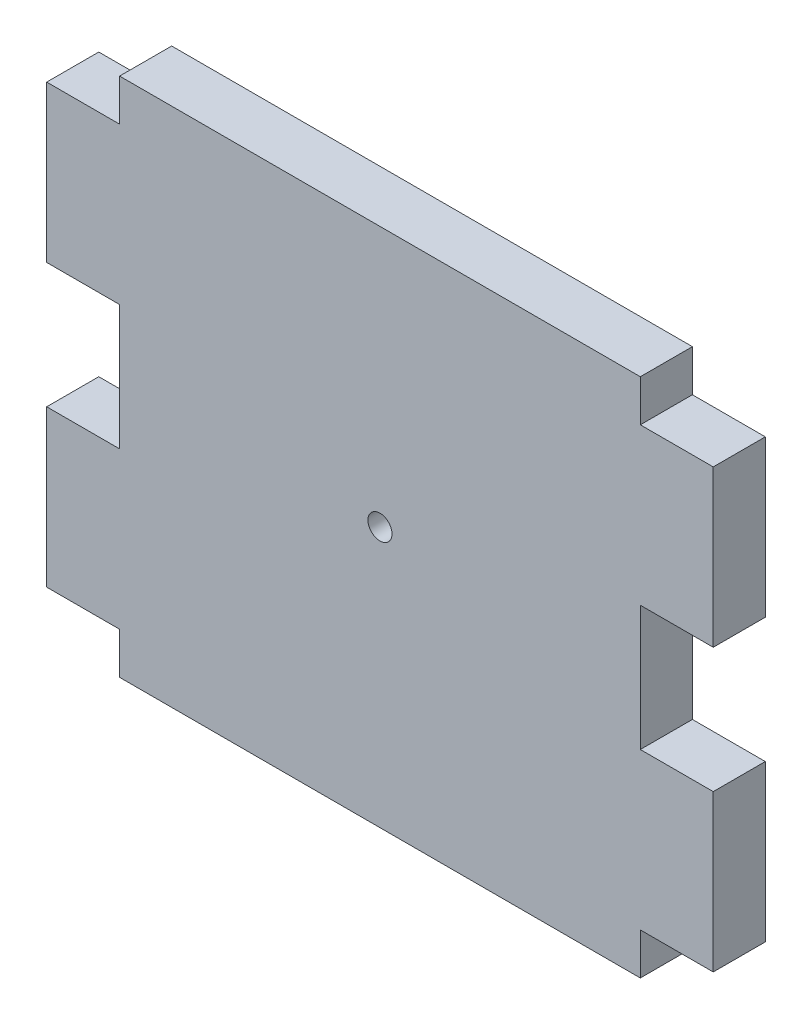
ISO-10303-21;
HEADER;
FILE_DESCRIPTION(('STEP AP214'),'2;1');
FILE_NAME('part.step','',(''),(''),'','','');
FILE_SCHEMA(('AUTOMOTIVE_DESIGN { 1 0 10303 214 1 1 1 1 }'));
ENDSEC;
DATA;
#1=APPLICATION_CONTEXT('core data for automotive mechanical design processes');
#2=APPLICATION_PROTOCOL_DEFINITION('international standard','automotive_design',2000,#1);
#3=PRODUCT_CONTEXT('',#1,'mechanical');
#4=PRODUCT('Part','Part','',(#3));
#5=PRODUCT_RELATED_PRODUCT_CATEGORY('part','',(#4));
#6=PRODUCT_DEFINITION_FORMATION('','',#4);
#7=PRODUCT_DEFINITION_CONTEXT('part definition',#1,'design');
#8=PRODUCT_DEFINITION('design','',#6,#7);
#9=PRODUCT_DEFINITION_SHAPE('','',#8);
#10=(LENGTH_UNIT() NAMED_UNIT(*) SI_UNIT(.MILLI.,.METRE.));
#11=(NAMED_UNIT(*) PLANE_ANGLE_UNIT() SI_UNIT($,.RADIAN.));
#12=(NAMED_UNIT(*) SI_UNIT($,.STERADIAN.) SOLID_ANGLE_UNIT());
#13=UNCERTAINTY_MEASURE_WITH_UNIT(LENGTH_MEASURE(1.E-05),#10,'distance_accuracy_value','');
#14=(GEOMETRIC_REPRESENTATION_CONTEXT(3) GLOBAL_UNCERTAINTY_ASSIGNED_CONTEXT((#13)) GLOBAL_UNIT_ASSIGNED_CONTEXT((#10,
#11,#12)) REPRESENTATION_CONTEXT('',''));
#15=CARTESIAN_POINT('',(0.,0.,0.));
#16=DIRECTION('',(0.,0.,1.));
#17=DIRECTION('',(1.,0.,0.));
#18=AXIS2_PLACEMENT_3D('',#15,#16,#17);
#19=CARTESIAN_POINT('',(0.,-4.00000000000001,5.));
#20=DIRECTION('',(1.,0.,0.));
#21=DIRECTION('',(0.,0.,-1.));
#22=AXIS2_PLACEMENT_3D('',#19,#20,#21);
#23=PLANE('',#22);
#24=DIRECTION('',(0.,-1.,0.));
#25=VECTOR('',#24,1.);
#26=CARTESIAN_POINT('',(0.,-4.00000000000001,0.));
#27=LINE('',#26,#25);
#28=CARTESIAN_POINT('',(0.,0.,0.));
#29=VERTEX_POINT('',#28);
#30=CARTESIAN_POINT('',(0.,-4.00000000000001,0.));
#31=VERTEX_POINT('',#30);
#32=EDGE_CURVE('E212',#29,#31,#27,.T.);
#33=ORIENTED_EDGE('',*,*,#32,.T.);
#34=DIRECTION('',(0.,0.,-1.));
#35=VECTOR('',#34,1.);
#36=CARTESIAN_POINT('',(0.,-4.00000000000001,5.));
#37=LINE('',#36,#35);
#38=CARTESIAN_POINT('',(0.,-4.00000000000001,5.));
#39=VERTEX_POINT('',#38);
#40=EDGE_CURVE('E11',#39,#31,#37,.T.);
#41=ORIENTED_EDGE('',*,*,#40,.F.);
#42=DIRECTION('',(0.,-1.,0.));
#43=VECTOR('',#42,1.);
#44=CARTESIAN_POINT('',(0.,-4.00000000000001,5.));
#45=LINE('',#44,#43);
#46=CARTESIAN_POINT('',(0.,0.,5.));
#47=VERTEX_POINT('',#46);
#48=EDGE_CURVE('E270',#47,#39,#45,.T.);
#49=ORIENTED_EDGE('',*,*,#48,.F.);
#50=DIRECTION('',(0.,0.,-1.));
#51=VECTOR('',#50,1.);
#52=CARTESIAN_POINT('',(0.,0.,5.));
#53=LINE('',#52,#51);
#54=EDGE_CURVE('E208',#47,#29,#53,.T.);
#55=ORIENTED_EDGE('',*,*,#54,.T.);
#56=EDGE_LOOP('',(#33,#41,#49,#55));
#57=FACE_BOUND('',#56,.T.);
#58=ADVANCED_FACE('F38',(#57),#23,.F.);
#59=CARTESIAN_POINT('',(0.,-4.00000000000001,5.));
#60=DIRECTION('',(0.,-1.,0.));
#61=DIRECTION('',(1.,0.,0.));
#62=AXIS2_PLACEMENT_3D('',#59,#60,#61);
#63=PLANE('',#62);
#64=DIRECTION('',(-1.,0.,0.));
#65=VECTOR('',#64,1.);
#66=CARTESIAN_POINT('',(0.,-4.00000000000001,0.));
#67=LINE('',#66,#65);
#68=CARTESIAN_POINT('',(-7.,-4.00000000000001,0.));
#69=VERTEX_POINT('',#68);
#70=EDGE_CURVE('E216',#31,#69,#67,.T.);
#71=ORIENTED_EDGE('',*,*,#70,.T.);
#72=DIRECTION('',(0.,0.,-1.));
#73=VECTOR('',#72,1.);
#74=CARTESIAN_POINT('',(-7.,-4.00000000000001,5.));
#75=LINE('',#74,#73);
#76=CARTESIAN_POINT('',(-7.,-4.00000000000001,5.));
#77=VERTEX_POINT('',#76);
#78=EDGE_CURVE('E48',#77,#69,#75,.T.);
#79=ORIENTED_EDGE('',*,*,#78,.F.);
#80=DIRECTION('',(-1.,0.,0.));
#81=VECTOR('',#80,1.);
#82=CARTESIAN_POINT('',(0.,-4.00000000000001,5.));
#83=LINE('',#82,#81);
#84=EDGE_CURVE('E135',#39,#77,#83,.T.);
#85=ORIENTED_EDGE('',*,*,#84,.F.);
#86=ORIENTED_EDGE('',*,*,#40,.T.);
#87=EDGE_LOOP('',(#71,#79,#85,#86));
#88=FACE_BOUND('',#87,.T.);
#89=ADVANCED_FACE('F423',(#88),#63,.F.);
#90=CARTESIAN_POINT('',(-7.,-4.00000000000001,5.));
#91=DIRECTION('',(1.,0.,0.));
#92=DIRECTION('',(0.,1.,0.));
#93=AXIS2_PLACEMENT_3D('',#90,#91,#92);
#94=PLANE('',#93);
#95=DIRECTION('',(0.,-1.,0.));
#96=VECTOR('',#95,1.);
#97=CARTESIAN_POINT('',(-7.,-4.00000000000001,0.));
#98=LINE('',#97,#96);
#99=CARTESIAN_POINT('',(-7.,-19.,0.));
#100=VERTEX_POINT('',#99);
#101=EDGE_CURVE('E219',#69,#100,#98,.T.);
#102=ORIENTED_EDGE('',*,*,#101,.T.);
#103=DIRECTION('',(0.,0.,-1.));
#104=VECTOR('',#103,1.);
#105=CARTESIAN_POINT('',(-7.,-19.,5.));
#106=LINE('',#105,#104);
#107=CARTESIAN_POINT('',(-7.,-19.,5.));
#108=VERTEX_POINT('',#107);
#109=EDGE_CURVE('E329',#108,#100,#106,.T.);
#110=ORIENTED_EDGE('',*,*,#109,.F.);
#111=DIRECTION('',(0.,-1.,0.));
#112=VECTOR('',#111,1.);
#113=CARTESIAN_POINT('',(-7.,-4.00000000000001,5.));
#114=LINE('',#113,#112);
#115=EDGE_CURVE('E340',#77,#108,#114,.T.);
#116=ORIENTED_EDGE('',*,*,#115,.F.);
#117=ORIENTED_EDGE('',*,*,#78,.T.);
#118=EDGE_LOOP('',(#102,#110,#116,#117));
#119=FACE_BOUND('',#118,.T.);
#120=ADVANCED_FACE('F338',(#119),#94,.F.);
#121=CARTESIAN_POINT('',(-7.,-19.,5.));
#122=DIRECTION('',(0.,1.,0.));
#123=DIRECTION('',(0.,0.,1.));
#124=AXIS2_PLACEMENT_3D('',#121,#122,#123);
#125=PLANE('',#124);
#126=DIRECTION('',(1.,0.,0.));
#127=VECTOR('',#126,1.);
#128=CARTESIAN_POINT('',(-7.,-19.,0.));
#129=LINE('',#128,#127);
#130=CARTESIAN_POINT('',(0.,-19.,0.));
#131=VERTEX_POINT('',#130);
#132=EDGE_CURVE('E222',#100,#131,#129,.T.);
#133=ORIENTED_EDGE('',*,*,#132,.T.);
#134=DIRECTION('',(0.,0.,-1.));
#135=VECTOR('',#134,1.);
#136=CARTESIAN_POINT('',(0.,-19.,5.));
#137=LINE('',#136,#135);
#138=CARTESIAN_POINT('',(0.,-19.,5.));
#139=VERTEX_POINT('',#138);
#140=EDGE_CURVE('E325',#139,#131,#137,.T.);
#141=ORIENTED_EDGE('',*,*,#140,.F.);
#142=DIRECTION('',(1.,0.,0.));
#143=VECTOR('',#142,1.);
#144=CARTESIAN_POINT('',(-7.,-19.,5.));
#145=LINE('',#144,#143);
#146=EDGE_CURVE('E359',#108,#139,#145,.T.);
#147=ORIENTED_EDGE('',*,*,#146,.F.);
#148=ORIENTED_EDGE('',*,*,#109,.T.);
#149=EDGE_LOOP('',(#133,#141,#147,#148));
#150=FACE_BOUND('',#149,.T.);
#151=ADVANCED_FACE('F349',(#150),#125,.F.);
#152=CARTESIAN_POINT('',(0.,-31.,5.));
#153=DIRECTION('',(1.,0.,0.));
#154=DIRECTION('',(0.,0.,-1.));
#155=AXIS2_PLACEMENT_3D('',#152,#153,#154);
#156=PLANE('',#155);
#157=DIRECTION('',(0.,-1.,0.));
#158=VECTOR('',#157,1.);
#159=CARTESIAN_POINT('',(0.,-31.,0.));
#160=LINE('',#159,#158);
#161=CARTESIAN_POINT('',(0.,-31.,0.));
#162=VERTEX_POINT('',#161);
#163=EDGE_CURVE('E225',#131,#162,#160,.T.);
#164=ORIENTED_EDGE('',*,*,#163,.T.);
#165=DIRECTION('',(0.,0.,-1.));
#166=VECTOR('',#165,1.);
#167=CARTESIAN_POINT('',(0.,-31.,5.));
#168=LINE('',#167,#166);
#169=CARTESIAN_POINT('',(0.,-31.,5.));
#170=VERTEX_POINT('',#169);
#171=EDGE_CURVE('E321',#170,#162,#168,.T.);
#172=ORIENTED_EDGE('',*,*,#171,.F.);
#173=DIRECTION('',(0.,-1.,0.));
#174=VECTOR('',#173,1.);
#175=CARTESIAN_POINT('',(0.,-31.,5.));
#176=LINE('',#175,#174);
#177=EDGE_CURVE('E355',#139,#170,#176,.T.);
#178=ORIENTED_EDGE('',*,*,#177,.F.);
#179=ORIENTED_EDGE('',*,*,#140,.T.);
#180=EDGE_LOOP('',(#164,#172,#178,#179));
#181=FACE_BOUND('',#180,.T.);
#182=ADVANCED_FACE('F353',(#181),#156,.F.);
#183=CARTESIAN_POINT('',(-7.,-31.,5.));
#184=DIRECTION('',(0.,-1.,0.));
#185=DIRECTION('',(0.,0.,-1.));
#186=AXIS2_PLACEMENT_3D('',#183,#184,#185);
#187=PLANE('',#186);
#188=DIRECTION('',(-1.,0.,0.));
#189=VECTOR('',#188,1.);
#190=CARTESIAN_POINT('',(-7.,-31.,0.));
#191=LINE('',#190,#189);
#192=CARTESIAN_POINT('',(-7.,-31.,0.));
#193=VERTEX_POINT('',#192);
#194=EDGE_CURVE('E228',#162,#193,#191,.T.);
#195=ORIENTED_EDGE('',*,*,#194,.T.);
#196=DIRECTION('',(0.,0.,-1.));
#197=VECTOR('',#196,1.);
#198=CARTESIAN_POINT('',(-7.,-31.,5.));
#199=LINE('',#198,#197);
#200=CARTESIAN_POINT('',(-7.,-31.,5.));
#201=VERTEX_POINT('',#200);
#202=EDGE_CURVE('E317',#201,#193,#199,.T.);
#203=ORIENTED_EDGE('',*,*,#202,.F.);
#204=DIRECTION('',(-1.,0.,0.));
#205=VECTOR('',#204,1.);
#206=CARTESIAN_POINT('',(-7.,-31.,5.));
#207=LINE('',#206,#205);
#208=EDGE_CURVE('E358',#170,#201,#207,.T.);
#209=ORIENTED_EDGE('',*,*,#208,.F.);
#210=ORIENTED_EDGE('',*,*,#171,.T.);
#211=EDGE_LOOP('',(#195,#203,#209,#210));
#212=FACE_BOUND('',#211,.T.);
#213=ADVANCED_FACE('F436',(#212),#187,.F.);
#214=CARTESIAN_POINT('',(-7.,-46.,5.));
#215=DIRECTION('',(1.,0.,0.));
#216=DIRECTION('',(0.,1.,0.));
#217=AXIS2_PLACEMENT_3D('',#214,#215,#216);
#218=PLANE('',#217);
#219=DIRECTION('',(0.,-1.,0.));
#220=VECTOR('',#219,1.);
#221=CARTESIAN_POINT('',(-7.,-46.,0.));
#222=LINE('',#221,#220);
#223=CARTESIAN_POINT('',(-7.,-46.,0.));
#224=VERTEX_POINT('',#223);
#225=EDGE_CURVE('E231',#193,#224,#222,.T.);
#226=ORIENTED_EDGE('',*,*,#225,.T.);
#227=DIRECTION('',(0.,0.,-1.));
#228=VECTOR('',#227,1.);
#229=CARTESIAN_POINT('',(-7.,-46.,5.));
#230=LINE('',#229,#228);
#231=CARTESIAN_POINT('',(-7.,-46.,5.));
#232=VERTEX_POINT('',#231);
#233=EDGE_CURVE('E313',#232,#224,#230,.T.);
#234=ORIENTED_EDGE('',*,*,#233,.F.);
#235=DIRECTION('',(0.,-1.,0.));
#236=VECTOR('',#235,1.);
#237=CARTESIAN_POINT('',(-7.,-46.,5.));
#238=LINE('',#237,#236);
#239=EDGE_CURVE('E363',#201,#232,#238,.T.);
#240=ORIENTED_EDGE('',*,*,#239,.F.);
#241=ORIENTED_EDGE('',*,*,#202,.T.);
#242=EDGE_LOOP('',(#226,#234,#240,#241));
#243=FACE_BOUND('',#242,.T.);
#244=ADVANCED_FACE('F439',(#243),#218,.F.);
#245=CARTESIAN_POINT('',(0.,-46.,5.));
#246=DIRECTION('',(0.,1.,0.));
#247=DIRECTION('',(0.,0.,1.));
#248=AXIS2_PLACEMENT_3D('',#245,#246,#247);
#249=PLANE('',#248);
#250=DIRECTION('',(1.,0.,0.));
#251=VECTOR('',#250,1.);
#252=CARTESIAN_POINT('',(0.,-46.,0.));
#253=LINE('',#252,#251);
#254=CARTESIAN_POINT('',(0.,-46.,0.));
#255=VERTEX_POINT('',#254);
#256=EDGE_CURVE('E234',#224,#255,#253,.T.);
#257=ORIENTED_EDGE('',*,*,#256,.T.);
#258=DIRECTION('',(0.,0.,-1.));
#259=VECTOR('',#258,1.);
#260=CARTESIAN_POINT('',(0.,-46.,5.));
#261=LINE('',#260,#259);
#262=CARTESIAN_POINT('',(0.,-46.,5.));
#263=VERTEX_POINT('',#262);
#264=EDGE_CURVE('E309',#263,#255,#261,.T.);
#265=ORIENTED_EDGE('',*,*,#264,.F.);
#266=DIRECTION('',(1.,0.,0.));
#267=VECTOR('',#266,1.);
#268=CARTESIAN_POINT('',(0.,-46.,5.));
#269=LINE('',#268,#267);
#270=EDGE_CURVE('E370',#232,#263,#269,.T.);
#271=ORIENTED_EDGE('',*,*,#270,.F.);
#272=ORIENTED_EDGE('',*,*,#233,.T.);
#273=EDGE_LOOP('',(#257,#265,#271,#272));
#274=FACE_BOUND('',#273,.T.);
#275=ADVANCED_FACE('F443',(#274),#249,.F.);
#276=CARTESIAN_POINT('',(0.,-50.,5.));
#277=DIRECTION('',(1.,0.,0.));
#278=DIRECTION('',(0.,1.,0.));
#279=AXIS2_PLACEMENT_3D('',#276,#277,#278);
#280=PLANE('',#279);
#281=DIRECTION('',(0.,-1.,0.));
#282=VECTOR('',#281,1.);
#283=CARTESIAN_POINT('',(0.,-50.,0.));
#284=LINE('',#283,#282);
#285=CARTESIAN_POINT('',(0.,-50.,0.));
#286=VERTEX_POINT('',#285);
#287=EDGE_CURVE('E237',#255,#286,#284,.T.);
#288=ORIENTED_EDGE('',*,*,#287,.T.);
#289=DIRECTION('',(0.,0.,-1.));
#290=VECTOR('',#289,1.);
#291=CARTESIAN_POINT('',(0.,-50.,5.));
#292=LINE('',#291,#290);
#293=CARTESIAN_POINT('',(0.,-50.,5.));
#294=VERTEX_POINT('',#293);
#295=EDGE_CURVE('E305',#294,#286,#292,.T.);
#296=ORIENTED_EDGE('',*,*,#295,.F.);
#297=DIRECTION('',(0.,-1.,0.));
#298=VECTOR('',#297,1.);
#299=CARTESIAN_POINT('',(0.,-50.,5.));
#300=LINE('',#299,#298);
#301=EDGE_CURVE('E373',#263,#294,#300,.T.);
#302=ORIENTED_EDGE('',*,*,#301,.F.);
#303=ORIENTED_EDGE('',*,*,#264,.T.);
#304=EDGE_LOOP('',(#288,#296,#302,#303));
#305=FACE_BOUND('',#304,.T.);
#306=ADVANCED_FACE('F447',(#305),#280,.F.);
#307=CARTESIAN_POINT('',(50.,-50.,5.));
#308=DIRECTION('',(0.,1.,0.));
#309=DIRECTION('',(-1.,0.,0.));
#310=AXIS2_PLACEMENT_3D('',#307,#308,#309);
#311=PLANE('',#310);
#312=DIRECTION('',(1.,0.,0.));
#313=VECTOR('',#312,1.);
#314=CARTESIAN_POINT('',(50.,-50.,0.));
#315=LINE('',#314,#313);
#316=CARTESIAN_POINT('',(50.,-50.,0.));
#317=VERTEX_POINT('',#316);
#318=EDGE_CURVE('E240',#286,#317,#315,.T.);
#319=ORIENTED_EDGE('',*,*,#318,.T.);
#320=DIRECTION('',(0.,0.,-1.));
#321=VECTOR('',#320,1.);
#322=CARTESIAN_POINT('',(50.,-50.,5.));
#323=LINE('',#322,#321);
#324=CARTESIAN_POINT('',(50.,-50.,5.));
#325=VERTEX_POINT('',#324);
#326=EDGE_CURVE('E301',#325,#317,#323,.T.);
#327=ORIENTED_EDGE('',*,*,#326,.F.);
#328=DIRECTION('',(1.,0.,0.));
#329=VECTOR('',#328,1.);
#330=CARTESIAN_POINT('',(50.,-50.,5.));
#331=LINE('',#330,#329);
#332=EDGE_CURVE('E376',#294,#325,#331,.T.);
#333=ORIENTED_EDGE('',*,*,#332,.F.);
#334=ORIENTED_EDGE('',*,*,#295,.T.);
#335=EDGE_LOOP('',(#319,#327,#333,#334));
#336=FACE_BOUND('',#335,.T.);
#337=ADVANCED_FACE('F451',(#336),#311,.F.);
#338=CARTESIAN_POINT('',(50.,-46.,5.));
#339=DIRECTION('',(-1.,0.,0.));
#340=DIRECTION('',(0.,-1.,0.));
#341=AXIS2_PLACEMENT_3D('',#338,#339,#340);
#342=PLANE('',#341);
#343=DIRECTION('',(0.,1.,0.));
#344=VECTOR('',#343,1.);
#345=CARTESIAN_POINT('',(50.,-46.,0.));
#346=LINE('',#345,#344);
#347=CARTESIAN_POINT('',(50.,-46.,0.));
#348=VERTEX_POINT('',#347);
#349=EDGE_CURVE('E243',#317,#348,#346,.T.);
#350=ORIENTED_EDGE('',*,*,#349,.T.);
#351=DIRECTION('',(0.,0.,-1.));
#352=VECTOR('',#351,1.);
#353=CARTESIAN_POINT('',(50.,-46.,5.));
#354=LINE('',#353,#352);
#355=CARTESIAN_POINT('',(50.,-46.,5.));
#356=VERTEX_POINT('',#355);
#357=EDGE_CURVE('E297',#356,#348,#354,.T.);
#358=ORIENTED_EDGE('',*,*,#357,.F.);
#359=DIRECTION('',(0.,1.,0.));
#360=VECTOR('',#359,1.);
#361=CARTESIAN_POINT('',(50.,-46.,5.));
#362=LINE('',#361,#360);
#363=EDGE_CURVE('E379',#325,#356,#362,.T.);
#364=ORIENTED_EDGE('',*,*,#363,.F.);
#365=ORIENTED_EDGE('',*,*,#326,.T.);
#366=EDGE_LOOP('',(#350,#358,#364,#365));
#367=FACE_BOUND('',#366,.T.);
#368=ADVANCED_FACE('F455',(#367),#342,.F.);
#369=CARTESIAN_POINT('',(50.,-46.,5.));
#370=DIRECTION('',(0.,1.,0.));
#371=DIRECTION('',(0.,0.,1.));
#372=AXIS2_PLACEMENT_3D('',#369,#370,#371);
#373=PLANE('',#372);
#374=DIRECTION('',(1.,0.,0.));
#375=VECTOR('',#374,1.);
#376=CARTESIAN_POINT('',(50.,-46.,0.));
#377=LINE('',#376,#375);
#378=CARTESIAN_POINT('',(57.,-46.,0.));
#379=VERTEX_POINT('',#378);
#380=EDGE_CURVE('E246',#348,#379,#377,.T.);
#381=ORIENTED_EDGE('',*,*,#380,.T.);
#382=DIRECTION('',(0.,0.,-1.));
#383=VECTOR('',#382,1.);
#384=CARTESIAN_POINT('',(57.,-46.,5.));
#385=LINE('',#384,#383);
#386=CARTESIAN_POINT('',(57.,-46.,5.));
#387=VERTEX_POINT('',#386);
#388=EDGE_CURVE('E293',#387,#379,#385,.T.);
#389=ORIENTED_EDGE('',*,*,#388,.F.);
#390=DIRECTION('',(1.,0.,0.));
#391=VECTOR('',#390,1.);
#392=CARTESIAN_POINT('',(50.,-46.,5.));
#393=LINE('',#392,#391);
#394=EDGE_CURVE('E382',#356,#387,#393,.T.);
#395=ORIENTED_EDGE('',*,*,#394,.F.);
#396=ORIENTED_EDGE('',*,*,#357,.T.);
#397=EDGE_LOOP('',(#381,#389,#395,#396));
#398=FACE_BOUND('',#397,.T.);
#399=ADVANCED_FACE('F459',(#398),#373,.F.);
#400=CARTESIAN_POINT('',(57.,-46.,5.));
#401=DIRECTION('',(-1.,0.,0.));
#402=DIRECTION('',(0.,0.,1.));
#403=AXIS2_PLACEMENT_3D('',#400,#401,#402);
#404=PLANE('',#403);
#405=DIRECTION('',(0.,1.,0.));
#406=VECTOR('',#405,1.);
#407=CARTESIAN_POINT('',(57.,-46.,0.));
#408=LINE('',#407,#406);
#409=CARTESIAN_POINT('',(57.,-31.,0.));
#410=VERTEX_POINT('',#409);
#411=EDGE_CURVE('E249',#379,#410,#408,.T.);
#412=ORIENTED_EDGE('',*,*,#411,.T.);
#413=DIRECTION('',(0.,0.,-1.));
#414=VECTOR('',#413,1.);
#415=CARTESIAN_POINT('',(57.,-31.,5.));
#416=LINE('',#415,#414);
#417=CARTESIAN_POINT('',(57.,-31.,5.));
#418=VERTEX_POINT('',#417);
#419=EDGE_CURVE('E289',#418,#410,#416,.T.);
#420=ORIENTED_EDGE('',*,*,#419,.F.);
#421=DIRECTION('',(0.,1.,0.));
#422=VECTOR('',#421,1.);
#423=CARTESIAN_POINT('',(57.,-46.,5.));
#424=LINE('',#423,#422);
#425=EDGE_CURVE('E385',#387,#418,#424,.T.);
#426=ORIENTED_EDGE('',*,*,#425,.F.);
#427=ORIENTED_EDGE('',*,*,#388,.T.);
#428=EDGE_LOOP('',(#412,#420,#426,#427));
#429=FACE_BOUND('',#428,.T.);
#430=ADVANCED_FACE('F463',(#429),#404,.F.);
#431=CARTESIAN_POINT('',(57.,-31.,5.));
#432=DIRECTION('',(0.,-1.,0.));
#433=DIRECTION('',(1.,0.,0.));
#434=AXIS2_PLACEMENT_3D('',#431,#432,#433);
#435=PLANE('',#434);
#436=DIRECTION('',(-1.,0.,0.));
#437=VECTOR('',#436,1.);
#438=CARTESIAN_POINT('',(57.,-31.,0.));
#439=LINE('',#438,#437);
#440=CARTESIAN_POINT('',(50.,-31.,0.));
#441=VERTEX_POINT('',#440);
#442=EDGE_CURVE('E252',#410,#441,#439,.T.);
#443=ORIENTED_EDGE('',*,*,#442,.T.);
#444=DIRECTION('',(0.,0.,-1.));
#445=VECTOR('',#444,1.);
#446=CARTESIAN_POINT('',(50.,-31.,5.));
#447=LINE('',#446,#445);
#448=CARTESIAN_POINT('',(50.,-31.,5.));
#449=VERTEX_POINT('',#448);
#450=EDGE_CURVE('E285',#449,#441,#447,.T.);
#451=ORIENTED_EDGE('',*,*,#450,.F.);
#452=DIRECTION('',(-1.,0.,0.));
#453=VECTOR('',#452,1.);
#454=CARTESIAN_POINT('',(57.,-31.,5.));
#455=LINE('',#454,#453);
#456=EDGE_CURVE('E388',#418,#449,#455,.T.);
#457=ORIENTED_EDGE('',*,*,#456,.F.);
#458=ORIENTED_EDGE('',*,*,#419,.T.);
#459=EDGE_LOOP('',(#443,#451,#457,#458));
#460=FACE_BOUND('',#459,.T.);
#461=ADVANCED_FACE('F467',(#460),#435,.F.);
#462=CARTESIAN_POINT('',(50.,-19.,5.));
#463=DIRECTION('',(-1.,0.,0.));
#464=DIRECTION('',(0.,0.,1.));
#465=AXIS2_PLACEMENT_3D('',#462,#463,#464);
#466=PLANE('',#465);
#467=DIRECTION('',(0.,1.,0.));
#468=VECTOR('',#467,1.);
#469=CARTESIAN_POINT('',(50.,-19.,0.));
#470=LINE('',#469,#468);
#471=CARTESIAN_POINT('',(50.,-19.,0.));
#472=VERTEX_POINT('',#471);
#473=EDGE_CURVE('E255',#441,#472,#470,.T.);
#474=ORIENTED_EDGE('',*,*,#473,.T.);
#475=DIRECTION('',(0.,0.,-1.));
#476=VECTOR('',#475,1.);
#477=CARTESIAN_POINT('',(50.,-19.,5.));
#478=LINE('',#477,#476);
#479=CARTESIAN_POINT('',(50.,-19.,5.));
#480=VERTEX_POINT('',#479);
#481=EDGE_CURVE('E281',#480,#472,#478,.T.);
#482=ORIENTED_EDGE('',*,*,#481,.F.);
#483=DIRECTION('',(0.,1.,0.));
#484=VECTOR('',#483,1.);
#485=CARTESIAN_POINT('',(50.,-19.,5.));
#486=LINE('',#485,#484);
#487=EDGE_CURVE('E391',#449,#480,#486,.T.);
#488=ORIENTED_EDGE('',*,*,#487,.F.);
#489=ORIENTED_EDGE('',*,*,#450,.T.);
#490=EDGE_LOOP('',(#474,#482,#488,#489));
#491=FACE_BOUND('',#490,.T.);
#492=ADVANCED_FACE('F471',(#491),#466,.F.);
#493=CARTESIAN_POINT('',(57.,-19.,5.));
#494=DIRECTION('',(0.,1.,0.));
#495=DIRECTION('',(-1.,0.,0.));
#496=AXIS2_PLACEMENT_3D('',#493,#494,#495);
#497=PLANE('',#496);
#498=DIRECTION('',(1.,0.,0.));
#499=VECTOR('',#498,1.);
#500=CARTESIAN_POINT('',(57.,-19.,0.));
#501=LINE('',#500,#499);
#502=CARTESIAN_POINT('',(57.,-19.,0.));
#503=VERTEX_POINT('',#502);
#504=EDGE_CURVE('E258',#472,#503,#501,.T.);
#505=ORIENTED_EDGE('',*,*,#504,.T.);
#506=DIRECTION('',(0.,0.,-1.));
#507=VECTOR('',#506,1.);
#508=CARTESIAN_POINT('',(57.,-19.,5.));
#509=LINE('',#508,#507);
#510=CARTESIAN_POINT('',(57.,-19.,5.));
#511=VERTEX_POINT('',#510);
#512=EDGE_CURVE('E277',#511,#503,#509,.T.);
#513=ORIENTED_EDGE('',*,*,#512,.F.);
#514=DIRECTION('',(1.,0.,0.));
#515=VECTOR('',#514,1.);
#516=CARTESIAN_POINT('',(57.,-19.,5.));
#517=LINE('',#516,#515);
#518=EDGE_CURVE('E394',#480,#511,#517,.T.);
#519=ORIENTED_EDGE('',*,*,#518,.F.);
#520=ORIENTED_EDGE('',*,*,#481,.T.);
#521=EDGE_LOOP('',(#505,#513,#519,#520));
#522=FACE_BOUND('',#521,.T.);
#523=ADVANCED_FACE('F402',(#522),#497,.F.);
#524=CARTESIAN_POINT('',(57.,-4.,5.));
#525=DIRECTION('',(-1.,0.,0.));
#526=DIRECTION('',(0.,0.,1.));
#527=AXIS2_PLACEMENT_3D('',#524,#525,#526);
#528=PLANE('',#527);
#529=DIRECTION('',(0.,1.,0.));
#530=VECTOR('',#529,1.);
#531=CARTESIAN_POINT('',(57.,-4.,0.));
#532=LINE('',#531,#530);
#533=CARTESIAN_POINT('',(57.,-4.,0.));
#534=VERTEX_POINT('',#533);
#535=EDGE_CURVE('E261',#503,#534,#532,.T.);
#536=ORIENTED_EDGE('',*,*,#535,.T.);
#537=DIRECTION('',(0.,0.,-1.));
#538=VECTOR('',#537,1.);
#539=CARTESIAN_POINT('',(57.,-4.,5.));
#540=LINE('',#539,#538);
#541=CARTESIAN_POINT('',(57.,-4.,5.));
#542=VERTEX_POINT('',#541);
#543=EDGE_CURVE('E201',#542,#534,#540,.T.);
#544=ORIENTED_EDGE('',*,*,#543,.F.);
#545=DIRECTION('',(0.,1.,0.));
#546=VECTOR('',#545,1.);
#547=CARTESIAN_POINT('',(57.,-4.,5.));
#548=LINE('',#547,#546);
#549=EDGE_CURVE('E190',#511,#542,#548,.T.);
#550=ORIENTED_EDGE('',*,*,#549,.F.);
#551=ORIENTED_EDGE('',*,*,#512,.T.);
#552=EDGE_LOOP('',(#536,#544,#550,#551));
#553=FACE_BOUND('',#552,.T.);
#554=ADVANCED_FACE('F406',(#553),#528,.F.);
#555=CARTESIAN_POINT('',(50.,-4.,5.));
#556=DIRECTION('',(0.,-1.,0.));
#557=DIRECTION('',(1.,0.,0.));
#558=AXIS2_PLACEMENT_3D('',#555,#556,#557);
#559=PLANE('',#558);
#560=DIRECTION('',(-1.,0.,0.));
#561=VECTOR('',#560,1.);
#562=CARTESIAN_POINT('',(50.,-4.,0.));
#563=LINE('',#562,#561);
#564=CARTESIAN_POINT('',(50.,-4.,0.));
#565=VERTEX_POINT('',#564);
#566=EDGE_CURVE('E199',#534,#565,#563,.T.);
#567=ORIENTED_EDGE('',*,*,#566,.T.);
#568=DIRECTION('',(0.,0.,-1.));
#569=VECTOR('',#568,1.);
#570=CARTESIAN_POINT('',(50.,-4.,5.));
#571=LINE('',#570,#569);
#572=CARTESIAN_POINT('',(50.,-4.,5.));
#573=VERTEX_POINT('',#572);
#574=EDGE_CURVE('E196',#573,#565,#571,.T.);
#575=ORIENTED_EDGE('',*,*,#574,.F.);
#576=DIRECTION('',(-1.,0.,0.));
#577=VECTOR('',#576,1.);
#578=CARTESIAN_POINT('',(50.,-4.,5.));
#579=LINE('',#578,#577);
#580=EDGE_CURVE('E184',#542,#573,#579,.T.);
#581=ORIENTED_EDGE('',*,*,#580,.F.);
#582=ORIENTED_EDGE('',*,*,#543,.T.);
#583=EDGE_LOOP('',(#567,#575,#581,#582));
#584=FACE_BOUND('',#583,.T.);
#585=ADVANCED_FACE('F197',(#584),#559,.F.);
#586=CARTESIAN_POINT('',(50.,0.,5.));
#587=DIRECTION('',(-1.,0.,0.));
#588=DIRECTION('',(0.,0.,1.));
#589=AXIS2_PLACEMENT_3D('',#586,#587,#588);
#590=PLANE('',#589);
#591=DIRECTION('',(0.,1.,0.));
#592=VECTOR('',#591,1.);
#593=CARTESIAN_POINT('',(50.,0.,0.));
#594=LINE('',#593,#592);
#595=CARTESIAN_POINT('',(50.,0.,0.));
#596=VERTEX_POINT('',#595);
#597=EDGE_CURVE('E121',#565,#596,#594,.T.);
#598=ORIENTED_EDGE('',*,*,#597,.T.);
#599=DIRECTION('',(0.,0.,-1.));
#600=VECTOR('',#599,1.);
#601=CARTESIAN_POINT('',(50.,0.,5.));
#602=LINE('',#601,#600);
#603=CARTESIAN_POINT('',(50.,0.,5.));
#604=VERTEX_POINT('',#603);
#605=EDGE_CURVE('E202',#604,#596,#602,.T.);
#606=ORIENTED_EDGE('',*,*,#605,.F.);
#607=DIRECTION('',(0.,1.,0.));
#608=VECTOR('',#607,1.);
#609=CARTESIAN_POINT('',(50.,0.,5.));
#610=LINE('',#609,#608);
#611=EDGE_CURVE('E188',#573,#604,#610,.T.);
#612=ORIENTED_EDGE('',*,*,#611,.F.);
#613=ORIENTED_EDGE('',*,*,#574,.T.);
#614=EDGE_LOOP('',(#598,#606,#612,#613));
#615=FACE_BOUND('',#614,.T.);
#616=ADVANCED_FACE('F204',(#615),#590,.F.);
#617=CARTESIAN_POINT('',(0.,0.,5.));
#618=DIRECTION('',(0.,-1.,0.));
#619=DIRECTION('',(0.,0.,-1.));
#620=AXIS2_PLACEMENT_3D('',#617,#618,#619);
#621=PLANE('',#620);
#622=DIRECTION('',(-1.,0.,0.));
#623=VECTOR('',#622,1.);
#624=CARTESIAN_POINT('',(0.,0.,0.));
#625=LINE('',#624,#623);
#626=EDGE_CURVE('E127',#596,#29,#625,.T.);
#627=ORIENTED_EDGE('',*,*,#626,.T.);
#628=ORIENTED_EDGE('',*,*,#54,.F.);
#629=DIRECTION('',(-1.,0.,0.));
#630=VECTOR('',#629,1.);
#631=CARTESIAN_POINT('',(0.,0.,5.));
#632=LINE('',#631,#630);
#633=EDGE_CURVE('E56',#604,#47,#632,.T.);
#634=ORIENTED_EDGE('',*,*,#633,.F.);
#635=ORIENTED_EDGE('',*,*,#605,.T.);
#636=EDGE_LOOP('',(#627,#628,#634,#635));
#637=FACE_BOUND('',#636,.T.);
#638=ADVANCED_FACE('F410',(#637),#621,.F.);
#639=CARTESIAN_POINT('',(0.,0.,5.));
#640=DIRECTION('',(0.,0.,-1.));
#641=DIRECTION('',(-1.,0.,0.));
#642=AXIS2_PLACEMENT_3D('',#639,#640,#641);
#643=PLANE('',#642);
#644=CARTESIAN_POINT('',(25.,-25.,5.));
#645=DIRECTION('',(0.,0.,1.));
#646=DIRECTION('',(1.,0.,0.));
#647=AXIS2_PLACEMENT_3D('',#644,#645,#646);
#648=CIRCLE('',#647,1.15528118913883);
#649=CARTESIAN_POINT('',(26.1552811891388,-25.,5.));
#650=VERTEX_POINT('',#649);
#651=EDGE_CURVE('E525',#650,#650,#648,.T.);
#652=ORIENTED_EDGE('',*,*,#651,.F.);
#653=EDGE_LOOP('',(#652));
#654=FACE_BOUND('',#653,.T.);
#655=ORIENTED_EDGE('',*,*,#48,.T.);
#656=ORIENTED_EDGE('',*,*,#84,.T.);
#657=ORIENTED_EDGE('',*,*,#115,.T.);
#658=ORIENTED_EDGE('',*,*,#146,.T.);
#659=ORIENTED_EDGE('',*,*,#177,.T.);
#660=ORIENTED_EDGE('',*,*,#208,.T.);
#661=ORIENTED_EDGE('',*,*,#239,.T.);
#662=ORIENTED_EDGE('',*,*,#270,.T.);
#663=ORIENTED_EDGE('',*,*,#301,.T.);
#664=ORIENTED_EDGE('',*,*,#332,.T.);
#665=ORIENTED_EDGE('',*,*,#363,.T.);
#666=ORIENTED_EDGE('',*,*,#394,.T.);
#667=ORIENTED_EDGE('',*,*,#425,.T.);
#668=ORIENTED_EDGE('',*,*,#456,.T.);
#669=ORIENTED_EDGE('',*,*,#487,.T.);
#670=ORIENTED_EDGE('',*,*,#518,.T.);
#671=ORIENTED_EDGE('',*,*,#549,.T.);
#672=ORIENTED_EDGE('',*,*,#580,.T.);
#673=ORIENTED_EDGE('',*,*,#611,.T.);
#674=ORIENTED_EDGE('',*,*,#633,.T.);
#675=EDGE_LOOP('',(#655,#656,#657,#658,#659,#660,#661,#662,#663,#664,#665,#666,#667,#668,#669,
#670,#671,#672,#673,#674));
#676=FACE_BOUND('',#675,.T.);
#677=ADVANCED_FACE('F186',(#654,#676),#643,.F.);
#678=CARTESIAN_POINT('',(0.,0.,0.));
#679=DIRECTION('',(0.,0.,-1.));
#680=DIRECTION('',(-1.,0.,0.));
#681=AXIS2_PLACEMENT_3D('',#678,#679,#680);
#682=PLANE('',#681);
#683=CARTESIAN_POINT('',(25.,-25.,0.));
#684=DIRECTION('',(0.,0.,-1.));
#685=DIRECTION('',(-1.,0.,0.));
#686=AXIS2_PLACEMENT_3D('',#683,#684,#685);
#687=CIRCLE('',#686,1.15528118913883);
#688=CARTESIAN_POINT('',(23.8447188108612,-25.,0.));
#689=VERTEX_POINT('',#688);
#690=EDGE_CURVE('E41',#689,#689,#687,.T.);
#691=ORIENTED_EDGE('',*,*,#690,.F.);
#692=EDGE_LOOP('',(#691));
#693=FACE_BOUND('',#692,.T.);
#694=ORIENTED_EDGE('',*,*,#32,.F.);
#695=ORIENTED_EDGE('',*,*,#626,.F.);
#696=ORIENTED_EDGE('',*,*,#597,.F.);
#697=ORIENTED_EDGE('',*,*,#566,.F.);
#698=ORIENTED_EDGE('',*,*,#535,.F.);
#699=ORIENTED_EDGE('',*,*,#504,.F.);
#700=ORIENTED_EDGE('',*,*,#473,.F.);
#701=ORIENTED_EDGE('',*,*,#442,.F.);
#702=ORIENTED_EDGE('',*,*,#411,.F.);
#703=ORIENTED_EDGE('',*,*,#380,.F.);
#704=ORIENTED_EDGE('',*,*,#349,.F.);
#705=ORIENTED_EDGE('',*,*,#318,.F.);
#706=ORIENTED_EDGE('',*,*,#287,.F.);
#707=ORIENTED_EDGE('',*,*,#256,.F.);
#708=ORIENTED_EDGE('',*,*,#225,.F.);
#709=ORIENTED_EDGE('',*,*,#194,.F.);
#710=ORIENTED_EDGE('',*,*,#163,.F.);
#711=ORIENTED_EDGE('',*,*,#132,.F.);
#712=ORIENTED_EDGE('',*,*,#101,.F.);
#713=ORIENTED_EDGE('',*,*,#70,.F.);
#714=EDGE_LOOP('',(#694,#695,#696,#697,#698,#699,#700,#701,#702,#703,#704,#705,#706,#707,#708,
#709,#710,#711,#712,#713));
#715=FACE_BOUND('',#714,.T.);
#716=ADVANCED_FACE('F344',(#693,#715),#682,.T.);
#717=CARTESIAN_POINT('',(25.,-25.,-5.));
#718=DIRECTION('',(0.,0.,1.));
#719=DIRECTION('',(1.,0.,0.));
#720=AXIS2_PLACEMENT_3D('',#717,#718,#719);
#721=CYLINDRICAL_SURFACE('',#720,1.15528118913883);
#722=ORIENTED_EDGE('',*,*,#690,.T.);
#723=EDGE_LOOP('',(#722));
#724=FACE_BOUND('',#723,.T.);
#725=ORIENTED_EDGE('',*,*,#651,.T.);
#726=EDGE_LOOP('',(#725));
#727=FACE_BOUND('',#726,.T.);
#728=ADVANCED_FACE('F504',(#724,#727),#721,.F.);
#729=CLOSED_SHELL('',(#58,#89,#120,#151,#182,#213,#244,#275,#306,#337,#368,#399,#430,#461,#492,
#523,#554,#585,#616,#638,#677,#716,#728));
#730=MANIFOLD_SOLID_BREP('B2',#729);
#731=ADVANCED_BREP_SHAPE_REPRESENTATION('',(#18,#730),#14);
#732=SHAPE_DEFINITION_REPRESENTATION(#9,#731);
ENDSEC;
END-ISO-10303-21;
